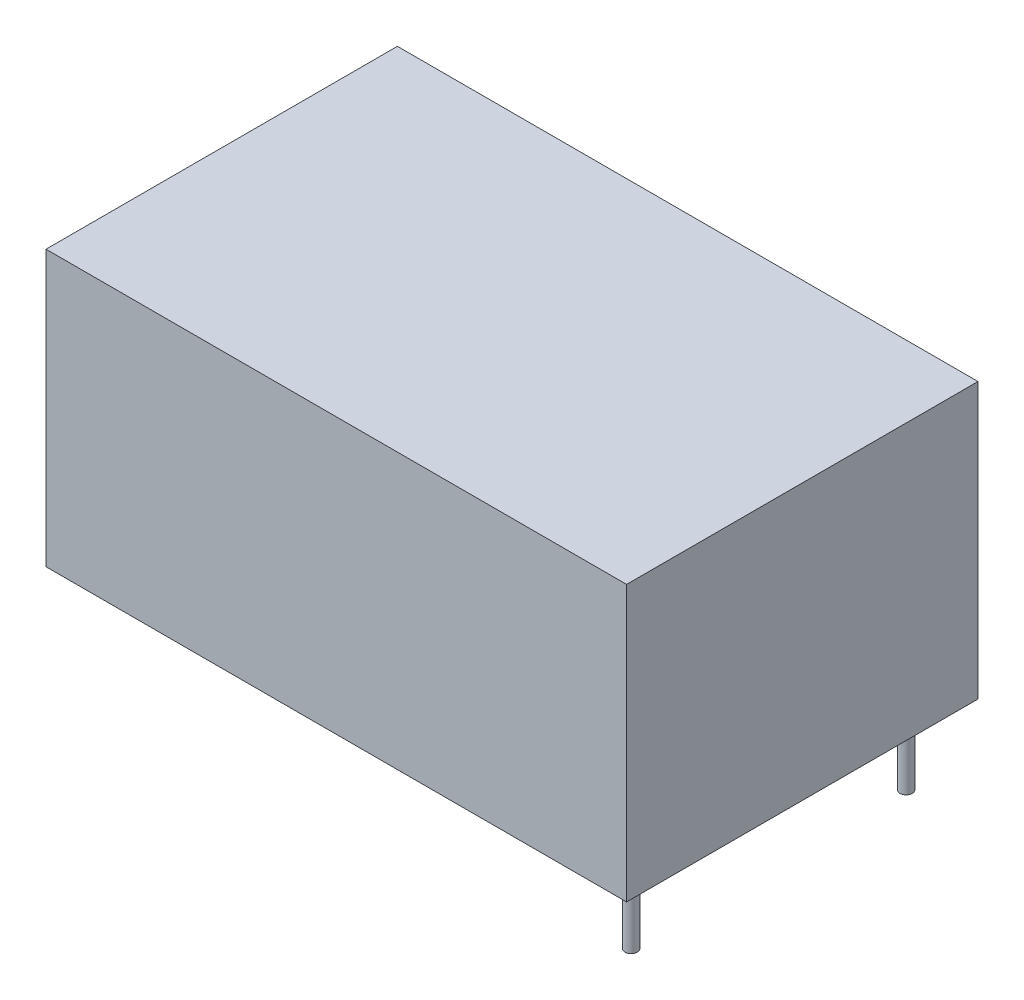
ISO-10303-21;
HEADER;
FILE_DESCRIPTION(('STEP AP214'),'2;1');
FILE_NAME('part.step','',(''),(''),'','','');
FILE_SCHEMA(('AUTOMOTIVE_DESIGN { 1 0 10303 214 1 1 1 1 }'));
ENDSEC;
DATA;
#1=APPLICATION_CONTEXT('core data for automotive mechanical design processes');
#2=APPLICATION_PROTOCOL_DEFINITION('international standard','automotive_design',2000,#1);
#3=PRODUCT_CONTEXT('',#1,'mechanical');
#4=PRODUCT('Part','Part','',(#3));
#5=PRODUCT_RELATED_PRODUCT_CATEGORY('part','',(#4));
#6=PRODUCT_DEFINITION_FORMATION('','',#4);
#7=PRODUCT_DEFINITION_CONTEXT('part definition',#1,'design');
#8=PRODUCT_DEFINITION('design','',#6,#7);
#9=PRODUCT_DEFINITION_SHAPE('','',#8);
#10=(LENGTH_UNIT() NAMED_UNIT(*) SI_UNIT(.MILLI.,.METRE.));
#11=(NAMED_UNIT(*) PLANE_ANGLE_UNIT() SI_UNIT($,.RADIAN.));
#12=(NAMED_UNIT(*) SI_UNIT($,.STERADIAN.) SOLID_ANGLE_UNIT());
#13=UNCERTAINTY_MEASURE_WITH_UNIT(LENGTH_MEASURE(1.E-05),#10,'distance_accuracy_value','');
#14=(GEOMETRIC_REPRESENTATION_CONTEXT(3) GLOBAL_UNCERTAINTY_ASSIGNED_CONTEXT((#13)) GLOBAL_UNIT_ASSIGNED_CONTEXT((#10,
#11,#12)) REPRESENTATION_CONTEXT('',''));
#15=CARTESIAN_POINT('',(0.,0.,0.));
#16=DIRECTION('',(0.,0.,1.));
#17=DIRECTION('',(1.,0.,0.));
#18=AXIS2_PLACEMENT_3D('',#15,#16,#17);
#19=CARTESIAN_POINT('',(19.,18.,10.5601750547046));
#20=DIRECTION('',(0.,0.,1.));
#21=DIRECTION('',(0.,-1.,0.));
#22=AXIS2_PLACEMENT_3D('',#19,#20,#21);
#23=PLANE('',#22);
#24=DIRECTION('',(-1.,0.,0.));
#25=VECTOR('',#24,1.);
#26=CARTESIAN_POINT('',(19.,0.,10.5601750547046));
#27=LINE('',#26,#25);
#28=CARTESIAN_POINT('',(19.,0.,10.5601750547046));
#29=VERTEX_POINT('',#28);
#30=CARTESIAN_POINT('',(-19.,0.,10.5601750547046));
#31=VERTEX_POINT('',#30);
#32=EDGE_CURVE('E102',#29,#31,#27,.T.);
#33=ORIENTED_EDGE('',*,*,#32,.F.);
#34=DIRECTION('',(0.,-1.,0.));
#35=VECTOR('',#34,1.);
#36=CARTESIAN_POINT('',(19.,18.,10.5601750547046));
#37=LINE('',#36,#35);
#38=CARTESIAN_POINT('',(19.,18.,10.5601750547046));
#39=VERTEX_POINT('',#38);
#40=EDGE_CURVE('E11',#39,#29,#37,.T.);
#41=ORIENTED_EDGE('',*,*,#40,.F.);
#42=DIRECTION('',(-1.,0.,0.));
#43=VECTOR('',#42,1.);
#44=CARTESIAN_POINT('',(19.,18.,10.5601750547046));
#45=LINE('',#44,#43);
#46=CARTESIAN_POINT('',(-19.,18.,10.5601750547046));
#47=VERTEX_POINT('',#46);
#48=EDGE_CURVE('E95',#39,#47,#45,.T.);
#49=ORIENTED_EDGE('',*,*,#48,.T.);
#50=DIRECTION('',(0.,-1.,0.));
#51=VECTOR('',#50,1.);
#52=CARTESIAN_POINT('',(-19.,18.,10.5601750547046));
#53=LINE('',#52,#51);
#54=EDGE_CURVE('E40',#47,#31,#53,.T.);
#55=ORIENTED_EDGE('',*,*,#54,.T.);
#56=EDGE_LOOP('',(#33,#41,#49,#55));
#57=FACE_BOUND('',#56,.T.);
#58=ADVANCED_FACE('F37',(#57),#23,.T.);
#59=CARTESIAN_POINT('',(19.,18.,-12.4398249452954));
#60=DIRECTION('',(1.,0.,0.));
#61=DIRECTION('',(0.,0.,-1.));
#62=AXIS2_PLACEMENT_3D('',#59,#60,#61);
#63=PLANE('',#62);
#64=DIRECTION('',(0.,0.,1.));
#65=VECTOR('',#64,1.);
#66=CARTESIAN_POINT('',(19.,0.,-12.4398249452954));
#67=LINE('',#66,#65);
#68=CARTESIAN_POINT('',(19.,0.,-12.4398249452954));
#69=VERTEX_POINT('',#68);
#70=EDGE_CURVE('E97',#69,#29,#67,.T.);
#71=ORIENTED_EDGE('',*,*,#70,.F.);
#72=DIRECTION('',(0.,-1.,0.));
#73=VECTOR('',#72,1.);
#74=CARTESIAN_POINT('',(19.,18.,-12.4398249452954));
#75=LINE('',#74,#73);
#76=CARTESIAN_POINT('',(19.,18.,-12.4398249452954));
#77=VERTEX_POINT('',#76);
#78=EDGE_CURVE('E46',#77,#69,#75,.T.);
#79=ORIENTED_EDGE('',*,*,#78,.F.);
#80=DIRECTION('',(0.,0.,1.));
#81=VECTOR('',#80,1.);
#82=CARTESIAN_POINT('',(19.,18.,-12.4398249452954));
#83=LINE('',#82,#81);
#84=EDGE_CURVE('E92',#77,#39,#83,.T.);
#85=ORIENTED_EDGE('',*,*,#84,.T.);
#86=ORIENTED_EDGE('',*,*,#40,.T.);
#87=EDGE_LOOP('',(#71,#79,#85,#86));
#88=FACE_BOUND('',#87,.T.);
#89=ADVANCED_FACE('F113',(#88),#63,.T.);
#90=CARTESIAN_POINT('',(-19.,18.,-12.4398249452954));
#91=DIRECTION('',(0.,0.,-1.));
#92=DIRECTION('',(0.,1.,0.));
#93=AXIS2_PLACEMENT_3D('',#90,#91,#92);
#94=PLANE('',#93);
#95=DIRECTION('',(1.,0.,0.));
#96=VECTOR('',#95,1.);
#97=CARTESIAN_POINT('',(-19.,0.,-12.4398249452954));
#98=LINE('',#97,#96);
#99=CARTESIAN_POINT('',(-19.,0.,-12.4398249452954));
#100=VERTEX_POINT('',#99);
#101=EDGE_CURVE('E87',#100,#69,#98,.T.);
#102=ORIENTED_EDGE('',*,*,#101,.F.);
#103=DIRECTION('',(0.,-1.,0.));
#104=VECTOR('',#103,1.);
#105=CARTESIAN_POINT('',(-19.,18.,-12.4398249452954));
#106=LINE('',#105,#104);
#107=CARTESIAN_POINT('',(-19.,18.,-12.4398249452954));
#108=VERTEX_POINT('',#107);
#109=EDGE_CURVE('E82',#108,#100,#106,.T.);
#110=ORIENTED_EDGE('',*,*,#109,.F.);
#111=DIRECTION('',(1.,0.,0.));
#112=VECTOR('',#111,1.);
#113=CARTESIAN_POINT('',(-19.,18.,-12.4398249452954));
#114=LINE('',#113,#112);
#115=EDGE_CURVE('E85',#108,#77,#114,.T.);
#116=ORIENTED_EDGE('',*,*,#115,.T.);
#117=ORIENTED_EDGE('',*,*,#78,.T.);
#118=EDGE_LOOP('',(#102,#110,#116,#117));
#119=FACE_BOUND('',#118,.T.);
#120=ADVANCED_FACE('F84',(#119),#94,.T.);
#121=CARTESIAN_POINT('',(-19.,18.,10.5601750547046));
#122=DIRECTION('',(-1.,0.,0.));
#123=DIRECTION('',(0.,0.,1.));
#124=AXIS2_PLACEMENT_3D('',#121,#122,#123);
#125=PLANE('',#124);
#126=DIRECTION('',(0.,0.,-1.));
#127=VECTOR('',#126,1.);
#128=CARTESIAN_POINT('',(-19.,0.,10.5601750547046));
#129=LINE('',#128,#127);
#130=EDGE_CURVE('E105',#31,#100,#129,.T.);
#131=ORIENTED_EDGE('',*,*,#130,.F.);
#132=ORIENTED_EDGE('',*,*,#54,.F.);
#133=DIRECTION('',(0.,0.,-1.));
#134=VECTOR('',#133,1.);
#135=CARTESIAN_POINT('',(-19.,18.,10.5601750547046));
#136=LINE('',#135,#134);
#137=EDGE_CURVE('E91',#47,#108,#136,.T.);
#138=ORIENTED_EDGE('',*,*,#137,.T.);
#139=ORIENTED_EDGE('',*,*,#109,.T.);
#140=EDGE_LOOP('',(#131,#132,#138,#139));
#141=FACE_BOUND('',#140,.T.);
#142=ADVANCED_FACE('F94',(#141),#125,.T.);
#143=CARTESIAN_POINT('',(0.,18.,0.));
#144=DIRECTION('',(0.,-1.,0.));
#145=DIRECTION('',(0.,0.,-1.));
#146=AXIS2_PLACEMENT_3D('',#143,#144,#145);
#147=PLANE('',#146);
#148=ORIENTED_EDGE('',*,*,#48,.F.);
#149=ORIENTED_EDGE('',*,*,#84,.F.);
#150=ORIENTED_EDGE('',*,*,#115,.F.);
#151=ORIENTED_EDGE('',*,*,#137,.F.);
#152=EDGE_LOOP('',(#148,#149,#150,#151));
#153=FACE_BOUND('',#152,.T.);
#154=ADVANCED_FACE('F90',(#153),#147,.F.);
#155=CARTESIAN_POINT('',(0.,0.,0.));
#156=DIRECTION('',(0.,-1.,0.));
#157=DIRECTION('',(0.,0.,-1.));
#158=AXIS2_PLACEMENT_3D('',#155,#156,#157);
#159=PLANE('',#158);
#160=CARTESIAN_POINT('',(-16.8,0.,2.06017505470459));
#161=DIRECTION('',(0.,-1.,0.));
#162=DIRECTION('',(0.,0.,-1.));
#163=AXIS2_PLACEMENT_3D('',#160,#161,#162);
#164=CIRCLE('',#163,0.400000000000001);
#165=CARTESIAN_POINT('',(-16.8,0.,1.66017505470459));
#166=VERTEX_POINT('',#165);
#167=EDGE_CURVE('E169',#166,#166,#164,.T.);
#168=ORIENTED_EDGE('',*,*,#167,.F.);
#169=EDGE_LOOP('',(#168));
#170=FACE_BOUND('',#169,.T.);
#171=CARTESIAN_POINT('',(16.8,0.,8.0601750547046));
#172=DIRECTION('',(0.,-1.,0.));
#173=DIRECTION('',(0.,0.,-1.));
#174=AXIS2_PLACEMENT_3D('',#171,#172,#173);
#175=CIRCLE('',#174,0.400000000000002);
#176=CARTESIAN_POINT('',(16.8,0.,7.6601750547046));
#177=VERTEX_POINT('',#176);
#178=EDGE_CURVE('E168',#177,#177,#175,.T.);
#179=ORIENTED_EDGE('',*,*,#178,.F.);
#180=EDGE_LOOP('',(#179));
#181=FACE_BOUND('',#180,.T.);
#182=CARTESIAN_POINT('',(-16.8,0.,-3.93982494529541));
#183=DIRECTION('',(0.,-1.,0.));
#184=DIRECTION('',(0.,0.,-1.));
#185=AXIS2_PLACEMENT_3D('',#182,#183,#184);
#186=CIRCLE('',#185,0.400000000000001);
#187=CARTESIAN_POINT('',(-16.8,0.,-4.33982494529541));
#188=VERTEX_POINT('',#187);
#189=EDGE_CURVE('E178',#188,#188,#186,.T.);
#190=ORIENTED_EDGE('',*,*,#189,.F.);
#191=EDGE_LOOP('',(#190));
#192=FACE_BOUND('',#191,.T.);
#193=CARTESIAN_POINT('',(16.8,0.,-9.9398249452954));
#194=DIRECTION('',(0.,-1.,0.));
#195=DIRECTION('',(0.,0.,-1.));
#196=AXIS2_PLACEMENT_3D('',#193,#194,#195);
#197=CIRCLE('',#196,0.400000000000002);
#198=CARTESIAN_POINT('',(16.8,0.,-10.3398249452954));
#199=VERTEX_POINT('',#198);
#200=EDGE_CURVE('E183',#199,#199,#197,.T.);
#201=ORIENTED_EDGE('',*,*,#200,.F.);
#202=EDGE_LOOP('',(#201));
#203=FACE_BOUND('',#202,.T.);
#204=ORIENTED_EDGE('',*,*,#32,.T.);
#205=ORIENTED_EDGE('',*,*,#130,.T.);
#206=ORIENTED_EDGE('',*,*,#101,.T.);
#207=ORIENTED_EDGE('',*,*,#70,.T.);
#208=EDGE_LOOP('',(#204,#205,#206,#207));
#209=FACE_BOUND('',#208,.T.);
#210=ADVANCED_FACE('F112',(#170,#181,#192,#203,#209),#159,.T.);
#211=CARTESIAN_POINT('',(16.8,-5.,-9.9398249452954));
#212=DIRECTION('',(0.,1.,0.));
#213=DIRECTION('',(0.,0.,1.));
#214=AXIS2_PLACEMENT_3D('',#211,#212,#213);
#215=CYLINDRICAL_SURFACE('',#214,0.400000000000002);
#216=CARTESIAN_POINT('',(16.8,-5.,-9.9398249452954));
#217=DIRECTION('',(0.,-1.,0.));
#218=DIRECTION('',(0.,0.,-1.));
#219=AXIS2_PLACEMENT_3D('',#216,#217,#218);
#220=CIRCLE('',#219,0.400000000000002);
#221=CARTESIAN_POINT('',(16.8,-5.,-10.3398249452954));
#222=VERTEX_POINT('',#221);
#223=EDGE_CURVE('E106',#222,#222,#220,.T.);
#224=ORIENTED_EDGE('',*,*,#223,.F.);
#225=EDGE_LOOP('',(#224));
#226=FACE_BOUND('',#225,.T.);
#227=ORIENTED_EDGE('',*,*,#200,.T.);
#228=EDGE_LOOP('',(#227));
#229=FACE_BOUND('',#228,.T.);
#230=ADVANCED_FACE('F130',(#226,#229),#215,.T.);
#231=CARTESIAN_POINT('',(16.8,-5.,-9.9398249452954));
#232=DIRECTION('',(0.,-1.,0.));
#233=DIRECTION('',(0.,0.,-1.));
#234=AXIS2_PLACEMENT_3D('',#231,#232,#233);
#235=PLANE('',#234);
#236=ORIENTED_EDGE('',*,*,#223,.T.);
#237=EDGE_LOOP('',(#236));
#238=FACE_BOUND('',#237,.T.);
#239=ADVANCED_FACE('F135',(#238),#235,.T.);
#240=CARTESIAN_POINT('',(-16.8,-5.,-3.93982494529541));
#241=DIRECTION('',(0.,1.,0.));
#242=DIRECTION('',(0.,0.,1.));
#243=AXIS2_PLACEMENT_3D('',#240,#241,#242);
#244=CYLINDRICAL_SURFACE('',#243,0.400000000000001);
#245=CARTESIAN_POINT('',(-16.8,-5.,-3.93982494529541));
#246=DIRECTION('',(0.,-1.,0.));
#247=DIRECTION('',(0.,0.,-1.));
#248=AXIS2_PLACEMENT_3D('',#245,#246,#247);
#249=CIRCLE('',#248,0.400000000000001);
#250=CARTESIAN_POINT('',(-16.8,-5.,-4.33982494529541));
#251=VERTEX_POINT('',#250);
#252=EDGE_CURVE('E180',#251,#251,#249,.T.);
#253=ORIENTED_EDGE('',*,*,#252,.F.);
#254=EDGE_LOOP('',(#253));
#255=FACE_BOUND('',#254,.T.);
#256=ORIENTED_EDGE('',*,*,#189,.T.);
#257=EDGE_LOOP('',(#256));
#258=FACE_BOUND('',#257,.T.);
#259=ADVANCED_FACE('F139',(#255,#258),#244,.T.);
#260=CARTESIAN_POINT('',(-16.8,-5.,-3.93982494529541));
#261=DIRECTION('',(0.,-1.,0.));
#262=DIRECTION('',(0.,0.,-1.));
#263=AXIS2_PLACEMENT_3D('',#260,#261,#262);
#264=PLANE('',#263);
#265=ORIENTED_EDGE('',*,*,#252,.T.);
#266=EDGE_LOOP('',(#265));
#267=FACE_BOUND('',#266,.T.);
#268=ADVANCED_FACE('F143',(#267),#264,.T.);
#269=CARTESIAN_POINT('',(16.8,-5.,8.0601750547046));
#270=DIRECTION('',(0.,1.,0.));
#271=DIRECTION('',(0.,0.,1.));
#272=AXIS2_PLACEMENT_3D('',#269,#270,#271);
#273=CYLINDRICAL_SURFACE('',#272,0.400000000000002);
#274=CARTESIAN_POINT('',(16.8,-5.,8.0601750547046));
#275=DIRECTION('',(0.,-1.,0.));
#276=DIRECTION('',(0.,0.,-1.));
#277=AXIS2_PLACEMENT_3D('',#274,#275,#276);
#278=CIRCLE('',#277,0.400000000000002);
#279=CARTESIAN_POINT('',(16.8,-5.,7.6601750547046));
#280=VERTEX_POINT('',#279);
#281=EDGE_CURVE('E172',#280,#280,#278,.T.);
#282=ORIENTED_EDGE('',*,*,#281,.F.);
#283=EDGE_LOOP('',(#282));
#284=FACE_BOUND('',#283,.T.);
#285=ORIENTED_EDGE('',*,*,#178,.T.);
#286=EDGE_LOOP('',(#285));
#287=FACE_BOUND('',#286,.T.);
#288=ADVANCED_FACE('F147',(#284,#287),#273,.T.);
#289=CARTESIAN_POINT('',(16.8,-5.,8.0601750547046));
#290=DIRECTION('',(0.,-1.,0.));
#291=DIRECTION('',(0.,0.,-1.));
#292=AXIS2_PLACEMENT_3D('',#289,#290,#291);
#293=PLANE('',#292);
#294=ORIENTED_EDGE('',*,*,#281,.T.);
#295=EDGE_LOOP('',(#294));
#296=FACE_BOUND('',#295,.T.);
#297=ADVANCED_FACE('F151',(#296),#293,.T.);
#298=CARTESIAN_POINT('',(-16.8,-5.,2.06017505470459));
#299=DIRECTION('',(0.,1.,0.));
#300=DIRECTION('',(0.,0.,1.));
#301=AXIS2_PLACEMENT_3D('',#298,#299,#300);
#302=CYLINDRICAL_SURFACE('',#301,0.400000000000001);
#303=CARTESIAN_POINT('',(-16.8,-5.,2.06017505470459));
#304=DIRECTION('',(0.,-1.,0.));
#305=DIRECTION('',(0.,0.,-1.));
#306=AXIS2_PLACEMENT_3D('',#303,#304,#305);
#307=CIRCLE('',#306,0.400000000000001);
#308=CARTESIAN_POINT('',(-16.8,-5.,1.66017505470459));
#309=VERTEX_POINT('',#308);
#310=EDGE_CURVE('E167',#309,#309,#307,.T.);
#311=ORIENTED_EDGE('',*,*,#310,.F.);
#312=EDGE_LOOP('',(#311));
#313=FACE_BOUND('',#312,.T.);
#314=ORIENTED_EDGE('',*,*,#167,.T.);
#315=EDGE_LOOP('',(#314));
#316=FACE_BOUND('',#315,.T.);
#317=ADVANCED_FACE('F155',(#313,#316),#302,.T.);
#318=CARTESIAN_POINT('',(-16.8,-5.,2.06017505470459));
#319=DIRECTION('',(0.,-1.,0.));
#320=DIRECTION('',(0.,0.,-1.));
#321=AXIS2_PLACEMENT_3D('',#318,#319,#320);
#322=PLANE('',#321);
#323=ORIENTED_EDGE('',*,*,#310,.T.);
#324=EDGE_LOOP('',(#323));
#325=FACE_BOUND('',#324,.T.);
#326=ADVANCED_FACE('F159',(#325),#322,.T.);
#327=CLOSED_SHELL('',(#58,#89,#120,#142,#154,#210,#230,#239,#259,#268,#288,#297,#317,#326));
#328=MANIFOLD_SOLID_BREP('B2',#327);
#329=ADVANCED_BREP_SHAPE_REPRESENTATION('',(#18,#328),#14);
#330=SHAPE_DEFINITION_REPRESENTATION(#9,#329);
ENDSEC;
END-ISO-10303-21;
